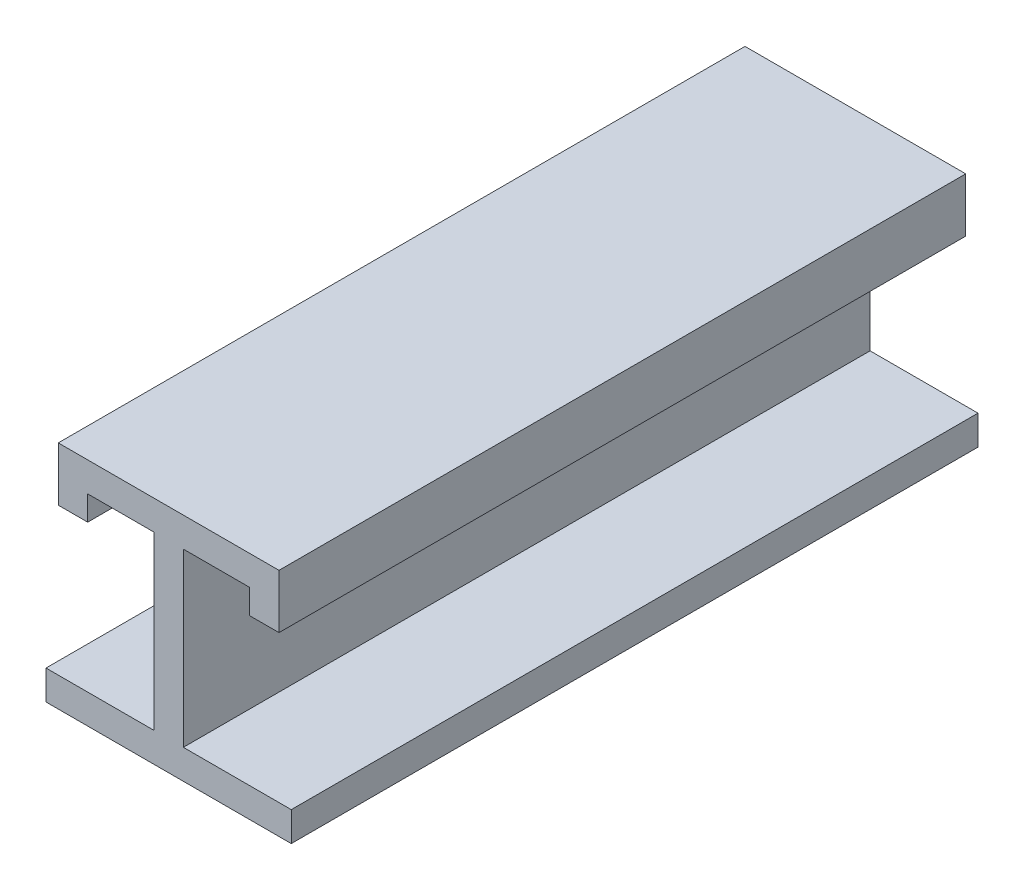
ISO-10303-21;
HEADER;
FILE_DESCRIPTION(('STEP AP214'),'2;1');
FILE_NAME('part.step','',(''),(''),'','','');
FILE_SCHEMA(('AUTOMOTIVE_DESIGN { 1 0 10303 214 1 1 1 1 }'));
ENDSEC;
DATA;
#1=APPLICATION_CONTEXT('core data for automotive mechanical design processes');
#2=APPLICATION_PROTOCOL_DEFINITION('international standard','automotive_design',2000,#1);
#3=PRODUCT_CONTEXT('',#1,'mechanical');
#4=PRODUCT('Part','Part','',(#3));
#5=PRODUCT_RELATED_PRODUCT_CATEGORY('part','',(#4));
#6=PRODUCT_DEFINITION_FORMATION('','',#4);
#7=PRODUCT_DEFINITION_CONTEXT('part definition',#1,'design');
#8=PRODUCT_DEFINITION('design','',#6,#7);
#9=PRODUCT_DEFINITION_SHAPE('','',#8);
#10=(LENGTH_UNIT() NAMED_UNIT(*) SI_UNIT(.MILLI.,.METRE.));
#11=(NAMED_UNIT(*) PLANE_ANGLE_UNIT() SI_UNIT($,.RADIAN.));
#12=(NAMED_UNIT(*) SI_UNIT($,.STERADIAN.) SOLID_ANGLE_UNIT());
#13=UNCERTAINTY_MEASURE_WITH_UNIT(LENGTH_MEASURE(1.E-05),#10,'distance_accuracy_value','');
#14=(GEOMETRIC_REPRESENTATION_CONTEXT(3) GLOBAL_UNCERTAINTY_ASSIGNED_CONTEXT((#13)) GLOBAL_UNIT_ASSIGNED_CONTEXT((#10,
#11,#12)) REPRESENTATION_CONTEXT('',''));
#15=CARTESIAN_POINT('',(0.,0.,0.));
#16=DIRECTION('',(0.,0.,1.));
#17=DIRECTION('',(1.,0.,0.));
#18=AXIS2_PLACEMENT_3D('',#15,#16,#17);
#19=CARTESIAN_POINT('',(45.,0.,140.));
#20=DIRECTION('',(1.,0.,0.));
#21=DIRECTION('',(0.,1.,0.));
#22=AXIS2_PLACEMENT_3D('',#19,#20,#21);
#23=PLANE('',#22);
#24=DIRECTION('',(0.,-1.,0.));
#25=VECTOR('',#24,1.);
#26=CARTESIAN_POINT('',(45.,0.,-140.));
#27=LINE('',#26,#25);
#28=CARTESIAN_POINT('',(45.,47.,-140.));
#29=VERTEX_POINT('',#28);
#30=CARTESIAN_POINT('',(45.,25.,-140.));
#31=VERTEX_POINT('',#30);
#32=EDGE_CURVE('E181',#29,#31,#27,.T.);
#33=ORIENTED_EDGE('',*,*,#32,.F.);
#34=DIRECTION('',(0.,0.,-1.));
#35=VECTOR('',#34,1.);
#36=CARTESIAN_POINT('',(45.,47.,140.));
#37=LINE('',#36,#35);
#38=CARTESIAN_POINT('',(45.,47.,140.));
#39=VERTEX_POINT('',#38);
#40=EDGE_CURVE('E11',#39,#29,#37,.T.);
#41=ORIENTED_EDGE('',*,*,#40,.F.);
#42=DIRECTION('',(0.,-1.,0.));
#43=VECTOR('',#42,1.);
#44=CARTESIAN_POINT('',(45.,0.,140.));
#45=LINE('',#44,#43);
#46=CARTESIAN_POINT('',(45.,25.,140.));
#47=VERTEX_POINT('',#46);
#48=EDGE_CURVE('E219',#39,#47,#45,.T.);
#49=ORIENTED_EDGE('',*,*,#48,.T.);
#50=DIRECTION('',(0.,0.,-1.));
#51=VECTOR('',#50,1.);
#52=CARTESIAN_POINT('',(45.,25.,140.));
#53=LINE('',#52,#51);
#54=EDGE_CURVE('E53',#47,#31,#53,.T.);
#55=ORIENTED_EDGE('',*,*,#54,.T.);
#56=EDGE_LOOP('',(#33,#41,#49,#55));
#57=FACE_BOUND('',#56,.T.);
#58=ADVANCED_FACE('F37',(#57),#23,.T.);
#59=CARTESIAN_POINT('',(0.,47.,140.));
#60=DIRECTION('',(0.,1.,0.));
#61=DIRECTION('',(0.,0.,1.));
#62=AXIS2_PLACEMENT_3D('',#59,#60,#61);
#63=PLANE('',#62);
#64=DIRECTION('',(1.,0.,0.));
#65=VECTOR('',#64,1.);
#66=CARTESIAN_POINT('',(0.,47.,-140.));
#67=LINE('',#66,#65);
#68=CARTESIAN_POINT('',(-45.,47.,-140.));
#69=VERTEX_POINT('',#68);
#70=EDGE_CURVE('E183',#69,#29,#67,.T.);
#71=ORIENTED_EDGE('',*,*,#70,.F.);
#72=DIRECTION('',(0.,0.,-1.));
#73=VECTOR('',#72,1.);
#74=CARTESIAN_POINT('',(-45.,47.,140.));
#75=LINE('',#74,#73);
#76=CARTESIAN_POINT('',(-45.,47.,140.));
#77=VERTEX_POINT('',#76);
#78=EDGE_CURVE('E45',#77,#69,#75,.T.);
#79=ORIENTED_EDGE('',*,*,#78,.F.);
#80=DIRECTION('',(1.,0.,0.));
#81=VECTOR('',#80,1.);
#82=CARTESIAN_POINT('',(0.,47.,140.));
#83=LINE('',#82,#81);
#84=EDGE_CURVE('E258',#77,#39,#83,.T.);
#85=ORIENTED_EDGE('',*,*,#84,.T.);
#86=ORIENTED_EDGE('',*,*,#40,.T.);
#87=EDGE_LOOP('',(#71,#79,#85,#86));
#88=FACE_BOUND('',#87,.T.);
#89=ADVANCED_FACE('F257',(#88),#63,.T.);
#90=CARTESIAN_POINT('',(-45.,0.,140.));
#91=DIRECTION('',(1.,0.,0.));
#92=DIRECTION('',(0.,0.,-1.));
#93=AXIS2_PLACEMENT_3D('',#90,#91,#92);
#94=PLANE('',#93);
#95=DIRECTION('',(0.,-1.,0.));
#96=VECTOR('',#95,1.);
#97=CARTESIAN_POINT('',(-45.,0.,-140.));
#98=LINE('',#97,#96);
#99=CARTESIAN_POINT('',(-45.,25.,-140.));
#100=VERTEX_POINT('',#99);
#101=EDGE_CURVE('E186',#69,#100,#98,.T.);
#102=ORIENTED_EDGE('',*,*,#101,.T.);
#103=DIRECTION('',(0.,0.,-1.));
#104=VECTOR('',#103,1.);
#105=CARTESIAN_POINT('',(-45.,25.,140.));
#106=LINE('',#105,#104);
#107=CARTESIAN_POINT('',(-45.,25.,140.));
#108=VERTEX_POINT('',#107);
#109=EDGE_CURVE('E242',#108,#100,#106,.T.);
#110=ORIENTED_EDGE('',*,*,#109,.F.);
#111=DIRECTION('',(0.,-1.,0.));
#112=VECTOR('',#111,1.);
#113=CARTESIAN_POINT('',(-45.,0.,140.));
#114=LINE('',#113,#112);
#115=EDGE_CURVE('E249',#77,#108,#114,.T.);
#116=ORIENTED_EDGE('',*,*,#115,.F.);
#117=ORIENTED_EDGE('',*,*,#78,.T.);
#118=EDGE_LOOP('',(#102,#110,#116,#117));
#119=FACE_BOUND('',#118,.T.);
#120=ADVANCED_FACE('F247',(#119),#94,.F.);
#121=CARTESIAN_POINT('',(0.,25.,140.));
#122=DIRECTION('',(0.,1.,0.));
#123=DIRECTION('',(0.,0.,1.));
#124=AXIS2_PLACEMENT_3D('',#121,#122,#123);
#125=PLANE('',#124);
#126=DIRECTION('',(1.,0.,0.));
#127=VECTOR('',#126,1.);
#128=CARTESIAN_POINT('',(0.,25.,-140.));
#129=LINE('',#128,#127);
#130=CARTESIAN_POINT('',(-33.,25.,-140.));
#131=VERTEX_POINT('',#130);
#132=EDGE_CURVE('E188',#100,#131,#129,.T.);
#133=ORIENTED_EDGE('',*,*,#132,.T.);
#134=DIRECTION('',(0.,0.,-1.));
#135=VECTOR('',#134,1.);
#136=CARTESIAN_POINT('',(-33.,25.,140.));
#137=LINE('',#136,#135);
#138=CARTESIAN_POINT('',(-33.,25.,140.));
#139=VERTEX_POINT('',#138);
#140=EDGE_CURVE('E240',#139,#131,#137,.T.);
#141=ORIENTED_EDGE('',*,*,#140,.F.);
#142=DIRECTION('',(1.,0.,0.));
#143=VECTOR('',#142,1.);
#144=CARTESIAN_POINT('',(0.,25.,140.));
#145=LINE('',#144,#143);
#146=EDGE_CURVE('E511',#108,#139,#145,.T.);
#147=ORIENTED_EDGE('',*,*,#146,.F.);
#148=ORIENTED_EDGE('',*,*,#109,.T.);
#149=EDGE_LOOP('',(#133,#141,#147,#148));
#150=FACE_BOUND('',#149,.T.);
#151=ADVANCED_FACE('F276',(#150),#125,.F.);
#152=CARTESIAN_POINT('',(-33.,0.,140.));
#153=DIRECTION('',(1.,0.,0.));
#154=DIRECTION('',(0.,1.,0.));
#155=AXIS2_PLACEMENT_3D('',#152,#153,#154);
#156=PLANE('',#155);
#157=DIRECTION('',(0.,-1.,0.));
#158=VECTOR('',#157,1.);
#159=CARTESIAN_POINT('',(-33.,0.,-140.));
#160=LINE('',#159,#158);
#161=CARTESIAN_POINT('',(-33.,35.,-140.));
#162=VERTEX_POINT('',#161);
#163=EDGE_CURVE('E191',#162,#131,#160,.T.);
#164=ORIENTED_EDGE('',*,*,#163,.F.);
#165=DIRECTION('',(0.,0.,-1.));
#166=VECTOR('',#165,1.);
#167=CARTESIAN_POINT('',(-33.,35.,140.));
#168=LINE('',#167,#166);
#169=CARTESIAN_POINT('',(-33.,35.,140.));
#170=VERTEX_POINT('',#169);
#171=EDGE_CURVE('E238',#170,#162,#168,.T.);
#172=ORIENTED_EDGE('',*,*,#171,.F.);
#173=DIRECTION('',(0.,-1.,0.));
#174=VECTOR('',#173,1.);
#175=CARTESIAN_POINT('',(-33.,0.,140.));
#176=LINE('',#175,#174);
#177=EDGE_CURVE('E335',#170,#139,#176,.T.);
#178=ORIENTED_EDGE('',*,*,#177,.T.);
#179=ORIENTED_EDGE('',*,*,#140,.T.);
#180=EDGE_LOOP('',(#164,#172,#178,#179));
#181=FACE_BOUND('',#180,.T.);
#182=ADVANCED_FACE('F281',(#181),#156,.T.);
#183=CARTESIAN_POINT('',(0.,35.,140.));
#184=DIRECTION('',(0.,1.,0.));
#185=DIRECTION('',(0.,0.,1.));
#186=AXIS2_PLACEMENT_3D('',#183,#184,#185);
#187=PLANE('',#186);
#188=DIRECTION('',(1.,0.,0.));
#189=VECTOR('',#188,1.);
#190=CARTESIAN_POINT('',(0.,35.,-140.));
#191=LINE('',#190,#189);
#192=CARTESIAN_POINT('',(-6.,35.,-140.));
#193=VERTEX_POINT('',#192);
#194=EDGE_CURVE('E194',#162,#193,#191,.T.);
#195=ORIENTED_EDGE('',*,*,#194,.T.);
#196=DIRECTION('',(0.,0.,-1.));
#197=VECTOR('',#196,1.);
#198=CARTESIAN_POINT('',(-6.,35.,140.));
#199=LINE('',#198,#197);
#200=CARTESIAN_POINT('',(-6.,35.,140.));
#201=VERTEX_POINT('',#200);
#202=EDGE_CURVE('E236',#201,#193,#199,.T.);
#203=ORIENTED_EDGE('',*,*,#202,.F.);
#204=DIRECTION('',(1.,0.,0.));
#205=VECTOR('',#204,1.);
#206=CARTESIAN_POINT('',(0.,35.,140.));
#207=LINE('',#206,#205);
#208=EDGE_CURVE('E164',#170,#201,#207,.T.);
#209=ORIENTED_EDGE('',*,*,#208,.F.);
#210=ORIENTED_EDGE('',*,*,#171,.T.);
#211=EDGE_LOOP('',(#195,#203,#209,#210));
#212=FACE_BOUND('',#211,.T.);
#213=ADVANCED_FACE('F285',(#212),#187,.F.);
#214=CARTESIAN_POINT('',(-6.,0.,140.));
#215=DIRECTION('',(-1.,0.,0.));
#216=DIRECTION('',(0.,0.,1.));
#217=AXIS2_PLACEMENT_3D('',#214,#215,#216);
#218=PLANE('',#217);
#219=DIRECTION('',(0.,1.,0.));
#220=VECTOR('',#219,1.);
#221=CARTESIAN_POINT('',(-6.,0.,-140.));
#222=LINE('',#221,#220);
#223=CARTESIAN_POINT('',(-6.,-35.,-140.));
#224=VERTEX_POINT('',#223);
#225=EDGE_CURVE('E197',#224,#193,#222,.T.);
#226=ORIENTED_EDGE('',*,*,#225,.F.);
#227=DIRECTION('',(0.,0.,-1.));
#228=VECTOR('',#227,1.);
#229=CARTESIAN_POINT('',(-6.,-35.,140.));
#230=LINE('',#229,#228);
#231=CARTESIAN_POINT('',(-6.,-35.,140.));
#232=VERTEX_POINT('',#231);
#233=EDGE_CURVE('E234',#232,#224,#230,.T.);
#234=ORIENTED_EDGE('',*,*,#233,.F.);
#235=DIRECTION('',(0.,1.,0.));
#236=VECTOR('',#235,1.);
#237=CARTESIAN_POINT('',(-6.,0.,140.));
#238=LINE('',#237,#236);
#239=EDGE_CURVE('E327',#232,#201,#238,.T.);
#240=ORIENTED_EDGE('',*,*,#239,.T.);
#241=ORIENTED_EDGE('',*,*,#202,.T.);
#242=EDGE_LOOP('',(#226,#234,#240,#241));
#243=FACE_BOUND('',#242,.T.);
#244=ADVANCED_FACE('F287',(#243),#218,.T.);
#245=CARTESIAN_POINT('',(0.,-35.,140.));
#246=DIRECTION('',(0.,1.,0.));
#247=DIRECTION('',(0.,0.,1.));
#248=AXIS2_PLACEMENT_3D('',#245,#246,#247);
#249=PLANE('',#248);
#250=DIRECTION('',(1.,0.,0.));
#251=VECTOR('',#250,1.);
#252=CARTESIAN_POINT('',(0.,-35.,-140.));
#253=LINE('',#252,#251);
#254=CARTESIAN_POINT('',(-50.0000000000001,-35.,-140.));
#255=VERTEX_POINT('',#254);
#256=EDGE_CURVE('E200',#255,#224,#253,.T.);
#257=ORIENTED_EDGE('',*,*,#256,.F.);
#258=DIRECTION('',(0.,0.,-1.));
#259=VECTOR('',#258,1.);
#260=CARTESIAN_POINT('',(-50.0000000000001,-35.,140.));
#261=LINE('',#260,#259);
#262=CARTESIAN_POINT('',(-50.0000000000001,-35.,140.));
#263=VERTEX_POINT('',#262);
#264=EDGE_CURVE('E232',#263,#255,#261,.T.);
#265=ORIENTED_EDGE('',*,*,#264,.F.);
#266=DIRECTION('',(1.,0.,0.));
#267=VECTOR('',#266,1.);
#268=CARTESIAN_POINT('',(0.,-35.,140.));
#269=LINE('',#268,#267);
#270=EDGE_CURVE('E330',#263,#232,#269,.T.);
#271=ORIENTED_EDGE('',*,*,#270,.T.);
#272=ORIENTED_EDGE('',*,*,#233,.T.);
#273=EDGE_LOOP('',(#257,#265,#271,#272));
#274=FACE_BOUND('',#273,.T.);
#275=ADVANCED_FACE('F290',(#274),#249,.T.);
#276=CARTESIAN_POINT('',(-50.0000000000001,0.,140.));
#277=DIRECTION('',(-1.,0.,0.));
#278=DIRECTION('',(0.,0.,1.));
#279=AXIS2_PLACEMENT_3D('',#276,#277,#278);
#280=PLANE('',#279);
#281=DIRECTION('',(0.,1.,0.));
#282=VECTOR('',#281,1.);
#283=CARTESIAN_POINT('',(-50.0000000000001,0.,-140.));
#284=LINE('',#283,#282);
#285=CARTESIAN_POINT('',(-50.0000000000001,-47.,-140.));
#286=VERTEX_POINT('',#285);
#287=EDGE_CURVE('E203',#286,#255,#284,.T.);
#288=ORIENTED_EDGE('',*,*,#287,.F.);
#289=DIRECTION('',(0.,0.,-1.));
#290=VECTOR('',#289,1.);
#291=CARTESIAN_POINT('',(-50.0000000000001,-47.,140.));
#292=LINE('',#291,#290);
#293=CARTESIAN_POINT('',(-50.0000000000001,-47.,140.));
#294=VERTEX_POINT('',#293);
#295=EDGE_CURVE('E230',#294,#286,#292,.T.);
#296=ORIENTED_EDGE('',*,*,#295,.F.);
#297=DIRECTION('',(0.,1.,0.));
#298=VECTOR('',#297,1.);
#299=CARTESIAN_POINT('',(-50.0000000000001,0.,140.));
#300=LINE('',#299,#298);
#301=EDGE_CURVE('E332',#294,#263,#300,.T.);
#302=ORIENTED_EDGE('',*,*,#301,.T.);
#303=ORIENTED_EDGE('',*,*,#264,.T.);
#304=EDGE_LOOP('',(#288,#296,#302,#303));
#305=FACE_BOUND('',#304,.T.);
#306=ADVANCED_FACE('F292',(#305),#280,.T.);
#307=CARTESIAN_POINT('',(0.,-47.,140.));
#308=DIRECTION('',(0.,1.,0.));
#309=DIRECTION('',(0.,0.,1.));
#310=AXIS2_PLACEMENT_3D('',#307,#308,#309);
#311=PLANE('',#310);
#312=DIRECTION('',(1.,0.,0.));
#313=VECTOR('',#312,1.);
#314=CARTESIAN_POINT('',(0.,-47.,-140.));
#315=LINE('',#314,#313);
#316=CARTESIAN_POINT('',(49.9999999999999,-47.,-140.));
#317=VERTEX_POINT('',#316);
#318=EDGE_CURVE('E207',#286,#317,#315,.T.);
#319=ORIENTED_EDGE('',*,*,#318,.T.);
#320=DIRECTION('',(0.,0.,-1.));
#321=VECTOR('',#320,1.);
#322=CARTESIAN_POINT('',(49.9999999999999,-47.,140.));
#323=LINE('',#322,#321);
#324=CARTESIAN_POINT('',(49.9999999999999,-47.,140.));
#325=VERTEX_POINT('',#324);
#326=EDGE_CURVE('E227',#325,#317,#323,.T.);
#327=ORIENTED_EDGE('',*,*,#326,.F.);
#328=DIRECTION('',(1.,0.,0.));
#329=VECTOR('',#328,1.);
#330=CARTESIAN_POINT('',(0.,-47.,140.));
#331=LINE('',#330,#329);
#332=EDGE_CURVE('E340',#294,#325,#331,.T.);
#333=ORIENTED_EDGE('',*,*,#332,.F.);
#334=ORIENTED_EDGE('',*,*,#295,.T.);
#335=EDGE_LOOP('',(#319,#327,#333,#334));
#336=FACE_BOUND('',#335,.T.);
#337=ADVANCED_FACE('F295',(#336),#311,.F.);
#338=CARTESIAN_POINT('',(49.9999999999999,0.,140.));
#339=DIRECTION('',(-1.,0.,0.));
#340=DIRECTION('',(0.,0.,1.));
#341=AXIS2_PLACEMENT_3D('',#338,#339,#340);
#342=PLANE('',#341);
#343=DIRECTION('',(0.,1.,0.));
#344=VECTOR('',#343,1.);
#345=CARTESIAN_POINT('',(49.9999999999999,0.,-140.));
#346=LINE('',#345,#344);
#347=CARTESIAN_POINT('',(49.9999999999999,-35.,-140.));
#348=VERTEX_POINT('',#347);
#349=EDGE_CURVE('E209',#317,#348,#346,.T.);
#350=ORIENTED_EDGE('',*,*,#349,.T.);
#351=DIRECTION('',(0.,0.,-1.));
#352=VECTOR('',#351,1.);
#353=CARTESIAN_POINT('',(49.9999999999999,-35.,140.));
#354=LINE('',#353,#352);
#355=CARTESIAN_POINT('',(49.9999999999999,-35.,140.));
#356=VERTEX_POINT('',#355);
#357=EDGE_CURVE('E225',#356,#348,#354,.T.);
#358=ORIENTED_EDGE('',*,*,#357,.F.);
#359=DIRECTION('',(0.,1.,0.));
#360=VECTOR('',#359,1.);
#361=CARTESIAN_POINT('',(49.9999999999999,0.,140.));
#362=LINE('',#361,#360);
#363=EDGE_CURVE('E341',#325,#356,#362,.T.);
#364=ORIENTED_EDGE('',*,*,#363,.F.);
#365=ORIENTED_EDGE('',*,*,#326,.T.);
#366=EDGE_LOOP('',(#350,#358,#364,#365));
#367=FACE_BOUND('',#366,.T.);
#368=ADVANCED_FACE('F299',(#367),#342,.F.);
#369=CARTESIAN_POINT('',(6.,-35.,-140.));
#370=VERTEX_POINT('',#369);
#371=EDGE_CURVE('E204',#370,#348,#253,.T.);
#372=ORIENTED_EDGE('',*,*,#371,.F.);
#373=DIRECTION('',(0.,0.,-1.));
#374=VECTOR('',#373,1.);
#375=CARTESIAN_POINT('',(6.,-35.,140.));
#376=LINE('',#375,#374);
#377=CARTESIAN_POINT('',(6.,-35.,140.));
#378=VERTEX_POINT('',#377);
#379=EDGE_CURVE('E223',#378,#370,#376,.T.);
#380=ORIENTED_EDGE('',*,*,#379,.F.);
#381=EDGE_CURVE('E334',#378,#356,#269,.T.);
#382=ORIENTED_EDGE('',*,*,#381,.T.);
#383=ORIENTED_EDGE('',*,*,#357,.T.);
#384=EDGE_LOOP('',(#372,#380,#382,#383));
#385=FACE_BOUND('',#384,.T.);
#386=ADVANCED_FACE('F303',(#385),#249,.T.);
#387=CARTESIAN_POINT('',(6.,0.,140.));
#388=DIRECTION('',(-1.,0.,0.));
#389=DIRECTION('',(0.,0.,1.));
#390=AXIS2_PLACEMENT_3D('',#387,#388,#389);
#391=PLANE('',#390);
#392=DIRECTION('',(0.,1.,0.));
#393=VECTOR('',#392,1.);
#394=CARTESIAN_POINT('',(6.,0.,-140.));
#395=LINE('',#394,#393);
#396=CARTESIAN_POINT('',(6.,35.,-140.));
#397=VERTEX_POINT('',#396);
#398=EDGE_CURVE('E212',#370,#397,#395,.T.);
#399=ORIENTED_EDGE('',*,*,#398,.T.);
#400=DIRECTION('',(0.,0.,-1.));
#401=VECTOR('',#400,1.);
#402=CARTESIAN_POINT('',(6.,35.,140.));
#403=LINE('',#402,#401);
#404=CARTESIAN_POINT('',(6.,35.,140.));
#405=VERTEX_POINT('',#404);
#406=EDGE_CURVE('E172',#405,#397,#403,.T.);
#407=ORIENTED_EDGE('',*,*,#406,.F.);
#408=DIRECTION('',(0.,1.,0.));
#409=VECTOR('',#408,1.);
#410=CARTESIAN_POINT('',(6.,0.,140.));
#411=LINE('',#410,#409);
#412=EDGE_CURVE('E159',#378,#405,#411,.T.);
#413=ORIENTED_EDGE('',*,*,#412,.F.);
#414=ORIENTED_EDGE('',*,*,#379,.T.);
#415=EDGE_LOOP('',(#399,#407,#413,#414));
#416=FACE_BOUND('',#415,.T.);
#417=ADVANCED_FACE('F307',(#416),#391,.F.);
#418=CARTESIAN_POINT('',(33.,35.,-140.));
#419=VERTEX_POINT('',#418);
#420=EDGE_CURVE('E169',#397,#419,#191,.T.);
#421=ORIENTED_EDGE('',*,*,#420,.T.);
#422=DIRECTION('',(0.,0.,-1.));
#423=VECTOR('',#422,1.);
#424=CARTESIAN_POINT('',(33.,35.,140.));
#425=LINE('',#424,#423);
#426=CARTESIAN_POINT('',(33.,35.,140.));
#427=VERTEX_POINT('',#426);
#428=EDGE_CURVE('E166',#427,#419,#425,.T.);
#429=ORIENTED_EDGE('',*,*,#428,.F.);
#430=EDGE_CURVE('E151',#405,#427,#207,.T.);
#431=ORIENTED_EDGE('',*,*,#430,.F.);
#432=ORIENTED_EDGE('',*,*,#406,.T.);
#433=EDGE_LOOP('',(#421,#429,#431,#432));
#434=FACE_BOUND('',#433,.T.);
#435=ADVANCED_FACE('F167',(#434),#187,.F.);
#436=CARTESIAN_POINT('',(33.,0.,140.));
#437=DIRECTION('',(1.,0.,0.));
#438=DIRECTION('',(0.,1.,0.));
#439=AXIS2_PLACEMENT_3D('',#436,#437,#438);
#440=PLANE('',#439);
#441=DIRECTION('',(0.,-1.,0.));
#442=VECTOR('',#441,1.);
#443=CARTESIAN_POINT('',(33.,0.,-140.));
#444=LINE('',#443,#442);
#445=CARTESIAN_POINT('',(33.,25.,-140.));
#446=VERTEX_POINT('',#445);
#447=EDGE_CURVE('E214',#419,#446,#444,.T.);
#448=ORIENTED_EDGE('',*,*,#447,.T.);
#449=DIRECTION('',(0.,0.,-1.));
#450=VECTOR('',#449,1.);
#451=CARTESIAN_POINT('',(33.,25.,140.));
#452=LINE('',#451,#450);
#453=CARTESIAN_POINT('',(33.,25.,140.));
#454=VERTEX_POINT('',#453);
#455=EDGE_CURVE('E103',#454,#446,#452,.T.);
#456=ORIENTED_EDGE('',*,*,#455,.F.);
#457=DIRECTION('',(0.,-1.,0.));
#458=VECTOR('',#457,1.);
#459=CARTESIAN_POINT('',(33.,0.,140.));
#460=LINE('',#459,#458);
#461=EDGE_CURVE('E156',#427,#454,#460,.T.);
#462=ORIENTED_EDGE('',*,*,#461,.F.);
#463=ORIENTED_EDGE('',*,*,#428,.T.);
#464=EDGE_LOOP('',(#448,#456,#462,#463));
#465=FACE_BOUND('',#464,.T.);
#466=ADVANCED_FACE('F174',(#465),#440,.F.);
#467=CARTESIAN_POINT('',(0.,25.,140.));
#468=DIRECTION('',(0.,-1.,0.));
#469=DIRECTION('',(0.,0.,-1.));
#470=AXIS2_PLACEMENT_3D('',#467,#468,#469);
#471=PLANE('',#470);
#472=DIRECTION('',(-1.,0.,0.));
#473=VECTOR('',#472,1.);
#474=CARTESIAN_POINT('',(0.,25.,-140.));
#475=LINE('',#474,#473);
#476=EDGE_CURVE('E216',#31,#446,#475,.T.);
#477=ORIENTED_EDGE('',*,*,#476,.F.);
#478=ORIENTED_EDGE('',*,*,#54,.F.);
#479=DIRECTION('',(-1.,0.,0.));
#480=VECTOR('',#479,1.);
#481=CARTESIAN_POINT('',(0.,25.,140.));
#482=LINE('',#481,#480);
#483=EDGE_CURVE('E175',#47,#454,#482,.T.);
#484=ORIENTED_EDGE('',*,*,#483,.T.);
#485=ORIENTED_EDGE('',*,*,#455,.T.);
#486=EDGE_LOOP('',(#477,#478,#484,#485));
#487=FACE_BOUND('',#486,.T.);
#488=ADVANCED_FACE('F259',(#487),#471,.T.);
#489=CARTESIAN_POINT('',(0.,0.,140.));
#490=DIRECTION('',(0.,0.,1.));
#491=DIRECTION('',(1.,0.,0.));
#492=AXIS2_PLACEMENT_3D('',#489,#490,#491);
#493=PLANE('',#492);
#494=ORIENTED_EDGE('',*,*,#48,.F.);
#495=ORIENTED_EDGE('',*,*,#84,.F.);
#496=ORIENTED_EDGE('',*,*,#115,.T.);
#497=ORIENTED_EDGE('',*,*,#146,.T.);
#498=ORIENTED_EDGE('',*,*,#177,.F.);
#499=ORIENTED_EDGE('',*,*,#208,.T.);
#500=ORIENTED_EDGE('',*,*,#239,.F.);
#501=ORIENTED_EDGE('',*,*,#270,.F.);
#502=ORIENTED_EDGE('',*,*,#301,.F.);
#503=ORIENTED_EDGE('',*,*,#332,.T.);
#504=ORIENTED_EDGE('',*,*,#363,.T.);
#505=ORIENTED_EDGE('',*,*,#381,.F.);
#506=ORIENTED_EDGE('',*,*,#412,.T.);
#507=ORIENTED_EDGE('',*,*,#430,.T.);
#508=ORIENTED_EDGE('',*,*,#461,.T.);
#509=ORIENTED_EDGE('',*,*,#483,.F.);
#510=EDGE_LOOP('',(#494,#495,#496,#497,#498,#499,#500,#501,#502,#503,#504,#505,#506,#507,#508,#509));
#511=FACE_BOUND('',#510,.T.);
#512=ADVANCED_FACE('F153',(#511),#493,.T.);
#513=CARTESIAN_POINT('',(0.,0.,-140.));
#514=DIRECTION('',(0.,0.,1.));
#515=DIRECTION('',(1.,0.,0.));
#516=AXIS2_PLACEMENT_3D('',#513,#514,#515);
#517=PLANE('',#516);
#518=ORIENTED_EDGE('',*,*,#32,.T.);
#519=ORIENTED_EDGE('',*,*,#476,.T.);
#520=ORIENTED_EDGE('',*,*,#447,.F.);
#521=ORIENTED_EDGE('',*,*,#420,.F.);
#522=ORIENTED_EDGE('',*,*,#398,.F.);
#523=ORIENTED_EDGE('',*,*,#371,.T.);
#524=ORIENTED_EDGE('',*,*,#349,.F.);
#525=ORIENTED_EDGE('',*,*,#318,.F.);
#526=ORIENTED_EDGE('',*,*,#287,.T.);
#527=ORIENTED_EDGE('',*,*,#256,.T.);
#528=ORIENTED_EDGE('',*,*,#225,.T.);
#529=ORIENTED_EDGE('',*,*,#194,.F.);
#530=ORIENTED_EDGE('',*,*,#163,.T.);
#531=ORIENTED_EDGE('',*,*,#132,.F.);
#532=ORIENTED_EDGE('',*,*,#101,.F.);
#533=ORIENTED_EDGE('',*,*,#70,.T.);
#534=EDGE_LOOP('',(#518,#519,#520,#521,#522,#523,#524,#525,#526,#527,#528,#529,#530,#531,#532,#533));
#535=FACE_BOUND('',#534,.T.);
#536=ADVANCED_FACE('F256',(#535),#517,.F.);
#537=CLOSED_SHELL('',(#58,#89,#120,#151,#182,#213,#244,#275,#306,#337,#368,#386,#417,#435,#466,
#488,#512,#536));
#538=MANIFOLD_SOLID_BREP('B2',#537);
#539=ADVANCED_BREP_SHAPE_REPRESENTATION('',(#18,#538),#14);
#540=SHAPE_DEFINITION_REPRESENTATION(#9,#539);
ENDSEC;
END-ISO-10303-21;
